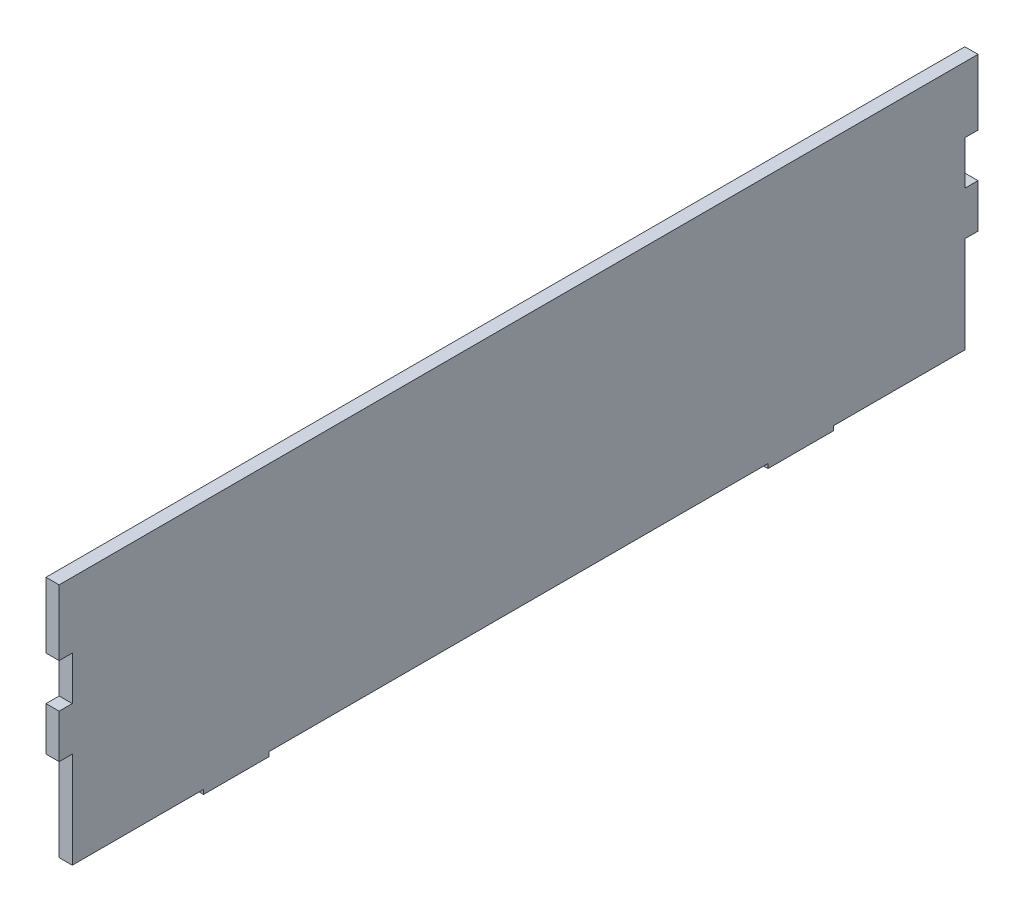
ISO-10303-21;
HEADER;
FILE_DESCRIPTION(('STEP AP214'),'2;1');
FILE_NAME('part.step','',(''),(''),'','','');
FILE_SCHEMA(('AUTOMOTIVE_DESIGN { 1 0 10303 214 1 1 1 1 }'));
ENDSEC;
DATA;
#1=APPLICATION_CONTEXT('core data for automotive mechanical design processes');
#2=APPLICATION_PROTOCOL_DEFINITION('international standard','automotive_design',2000,#1);
#3=PRODUCT_CONTEXT('',#1,'mechanical');
#4=PRODUCT('Part','Part','',(#3));
#5=PRODUCT_RELATED_PRODUCT_CATEGORY('part','',(#4));
#6=PRODUCT_DEFINITION_FORMATION('','',#4);
#7=PRODUCT_DEFINITION_CONTEXT('part definition',#1,'design');
#8=PRODUCT_DEFINITION('design','',#6,#7);
#9=PRODUCT_DEFINITION_SHAPE('','',#8);
#10=(LENGTH_UNIT() NAMED_UNIT(*) SI_UNIT(.MILLI.,.METRE.));
#11=(NAMED_UNIT(*) PLANE_ANGLE_UNIT() SI_UNIT($,.RADIAN.));
#12=(NAMED_UNIT(*) SI_UNIT($,.STERADIAN.) SOLID_ANGLE_UNIT());
#13=UNCERTAINTY_MEASURE_WITH_UNIT(LENGTH_MEASURE(1.E-05),#10,'distance_accuracy_value','');
#14=(GEOMETRIC_REPRESENTATION_CONTEXT(3) GLOBAL_UNCERTAINTY_ASSIGNED_CONTEXT((#13)) GLOBAL_UNIT_ASSIGNED_CONTEXT((#10,
#11,#12)) REPRESENTATION_CONTEXT('',''));
#15=CARTESIAN_POINT('',(0.,0.,0.));
#16=DIRECTION('',(0.,0.,1.));
#17=DIRECTION('',(1.,0.,0.));
#18=AXIS2_PLACEMENT_3D('',#15,#16,#17);
#19=CARTESIAN_POINT('',(0.,0.,-206.5));
#20=DIRECTION('',(0.,0.,-1.));
#21=DIRECTION('',(-1.,0.,0.));
#22=AXIS2_PLACEMENT_3D('',#19,#20,#21);
#23=PLANE('',#22);
#24=DIRECTION('',(1.,0.,0.));
#25=VECTOR('',#24,1.);
#26=CARTESIAN_POINT('',(2.99999999999998,-32.0782122905028,-206.5));
#27=LINE('',#26,#25);
#28=CARTESIAN_POINT('',(0.,-32.0782122905028,-206.5));
#29=VERTEX_POINT('',#28);
#30=CARTESIAN_POINT('',(2.99999999999998,-32.0782122905028,-206.5));
#31=VERTEX_POINT('',#30);
#32=EDGE_CURVE('E230',#29,#31,#27,.T.);
#33=ORIENTED_EDGE('',*,*,#32,.T.);
#34=DIRECTION('',(0.,-1.,0.));
#35=VECTOR('',#34,1.);
#36=CARTESIAN_POINT('',(3.,-1.07821229050276,-206.5));
#37=LINE('',#36,#35);
#38=CARTESIAN_POINT('',(3.00000000000002,-54.0782122905028,-206.5));
#39=VERTEX_POINT('',#38);
#40=EDGE_CURVE('E207',#31,#39,#37,.T.);
#41=ORIENTED_EDGE('',*,*,#40,.T.);
#42=DIRECTION('',(-1.,0.,0.));
#43=VECTOR('',#42,1.);
#44=CARTESIAN_POINT('',(0.,-54.0782122905028,-206.5));
#45=LINE('',#44,#43);
#46=CARTESIAN_POINT('',(0.,-54.0782122905028,-206.5));
#47=VERTEX_POINT('',#46);
#48=EDGE_CURVE('E11',#39,#47,#45,.T.);
#49=ORIENTED_EDGE('',*,*,#48,.T.);
#50=DIRECTION('',(0.,1.,0.));
#51=VECTOR('',#50,1.);
#52=CARTESIAN_POINT('',(0.,-59.0782122905028,-206.5));
#53=LINE('',#52,#51);
#54=EDGE_CURVE('E59',#47,#29,#53,.T.);
#55=ORIENTED_EDGE('',*,*,#54,.T.);
#56=EDGE_LOOP('',(#33,#41,#49,#55));
#57=FACE_BOUND('',#56,.T.);
#58=ADVANCED_FACE('F37',(#57),#23,.T.);
#59=DIRECTION('',(-1.,0.,0.));
#60=VECTOR('',#59,1.);
#61=CARTESIAN_POINT('',(2.99999999999998,-22.0782122905028,-206.5));
#62=LINE('',#61,#60);
#63=CARTESIAN_POINT('',(3.,-22.0782122905028,-206.5));
#64=VERTEX_POINT('',#63);
#65=CARTESIAN_POINT('',(0.,-22.0782122905028,-206.5));
#66=VERTEX_POINT('',#65);
#67=EDGE_CURVE('E52',#64,#66,#62,.T.);
#68=ORIENTED_EDGE('',*,*,#67,.T.);
#69=CARTESIAN_POINT('',(0.,-12.0782122905028,-206.5));
#70=VERTEX_POINT('',#69);
#71=EDGE_CURVE('E367',#66,#70,#53,.T.);
#72=ORIENTED_EDGE('',*,*,#71,.T.);
#73=DIRECTION('',(1.,0.,0.));
#74=VECTOR('',#73,1.);
#75=CARTESIAN_POINT('',(2.99999999999998,-12.0782122905028,-206.5));
#76=LINE('',#75,#74);
#77=CARTESIAN_POINT('',(3.,-12.0782122905028,-206.5));
#78=VERTEX_POINT('',#77);
#79=EDGE_CURVE('E211',#70,#78,#76,.T.);
#80=ORIENTED_EDGE('',*,*,#79,.T.);
#81=EDGE_CURVE('E373',#78,#64,#37,.T.);
#82=ORIENTED_EDGE('',*,*,#81,.T.);
#83=EDGE_LOOP('',(#68,#72,#80,#82));
#84=FACE_BOUND('',#83,.T.);
#85=ADVANCED_FACE('F424',(#84),#23,.T.);
#86=CARTESIAN_POINT('',(0.,0.,-2.5));
#87=DIRECTION('',(0.,0.,-1.));
#88=DIRECTION('',(-1.,0.,0.));
#89=AXIS2_PLACEMENT_3D('',#86,#87,#88);
#90=PLANE('',#89);
#91=DIRECTION('',(-1.,0.,0.));
#92=VECTOR('',#91,1.);
#93=CARTESIAN_POINT('',(2.99999999999998,-22.0782122905028,-2.5));
#94=LINE('',#93,#92);
#95=CARTESIAN_POINT('',(2.99999999999998,-22.0782122905028,-2.5));
#96=VERTEX_POINT('',#95);
#97=CARTESIAN_POINT('',(0.,-22.0782122905028,-2.5));
#98=VERTEX_POINT('',#97);
#99=EDGE_CURVE('E257',#96,#98,#94,.T.);
#100=ORIENTED_EDGE('',*,*,#99,.F.);
#101=DIRECTION('',(0.,1.,0.));
#102=VECTOR('',#101,1.);
#103=CARTESIAN_POINT('',(3.,-1.07821229050276,-2.5));
#104=LINE('',#103,#102);
#105=CARTESIAN_POINT('',(2.99999999999998,-12.0782122905028,-2.5));
#106=VERTEX_POINT('',#105);
#107=EDGE_CURVE('E375',#96,#106,#104,.T.);
#108=ORIENTED_EDGE('',*,*,#107,.T.);
#109=DIRECTION('',(1.,0.,0.));
#110=VECTOR('',#109,1.);
#111=CARTESIAN_POINT('',(2.99999999999998,-12.0782122905028,-2.5));
#112=LINE('',#111,#110);
#113=CARTESIAN_POINT('',(0.,-12.0782122905028,-2.5));
#114=VERTEX_POINT('',#113);
#115=EDGE_CURVE('E284',#114,#106,#112,.T.);
#116=ORIENTED_EDGE('',*,*,#115,.F.);
#117=DIRECTION('',(0.,-1.,0.));
#118=VECTOR('',#117,1.);
#119=CARTESIAN_POINT('',(0.,-59.0782122905028,-2.5));
#120=LINE('',#119,#118);
#121=EDGE_CURVE('E371',#114,#98,#120,.T.);
#122=ORIENTED_EDGE('',*,*,#121,.T.);
#123=EDGE_LOOP('',(#100,#108,#116,#122));
#124=FACE_BOUND('',#123,.T.);
#125=ADVANCED_FACE('F448',(#124),#90,.F.);
#126=DIRECTION('',(1.,0.,0.));
#127=VECTOR('',#126,1.);
#128=CARTESIAN_POINT('',(2.99999999999998,-32.0782122905028,-2.5));
#129=LINE('',#128,#127);
#130=CARTESIAN_POINT('',(0.,-32.0782122905028,-2.5));
#131=VERTEX_POINT('',#130);
#132=CARTESIAN_POINT('',(3.,-32.0782122905028,-2.5));
#133=VERTEX_POINT('',#132);
#134=EDGE_CURVE('E262',#131,#133,#129,.T.);
#135=ORIENTED_EDGE('',*,*,#134,.F.);
#136=CARTESIAN_POINT('',(0.,-54.0782122905028,-2.5));
#137=VERTEX_POINT('',#136);
#138=EDGE_CURVE('E370',#131,#137,#120,.T.);
#139=ORIENTED_EDGE('',*,*,#138,.T.);
#140=DIRECTION('',(1.,0.,0.));
#141=VECTOR('',#140,1.);
#142=CARTESIAN_POINT('',(-87.,-54.0782122905028,-2.5));
#143=LINE('',#142,#141);
#144=CARTESIAN_POINT('',(2.99999999999999,-54.0782122905028,-2.5));
#145=VERTEX_POINT('',#144);
#146=EDGE_CURVE('E361',#137,#145,#143,.T.);
#147=ORIENTED_EDGE('',*,*,#146,.T.);
#148=EDGE_CURVE('E376',#145,#133,#104,.T.);
#149=ORIENTED_EDGE('',*,*,#148,.T.);
#150=EDGE_LOOP('',(#135,#139,#147,#149));
#151=FACE_BOUND('',#150,.T.);
#152=ADVANCED_FACE('F389',(#151),#90,.F.);
#153=CARTESIAN_POINT('',(-87.,-54.0782122905028,-2.5));
#154=DIRECTION('',(0.,-1.,0.));
#155=DIRECTION('',(0.,0.,-1.));
#156=AXIS2_PLACEMENT_3D('',#153,#154,#155);
#157=PLANE('',#156);
#158=DIRECTION('',(0.,0.,-1.));
#159=VECTOR('',#158,1.);
#160=CARTESIAN_POINT('',(0.,-54.0782122905028,0.5));
#161=LINE('',#160,#159);
#162=CARTESIAN_POINT('',(0.,-54.0782122905028,-47.5));
#163=VERTEX_POINT('',#162);
#164=CARTESIAN_POINT('',(0.,-54.0782122905028,-161.5));
#165=VERTEX_POINT('',#164);
#166=EDGE_CURVE('E368',#163,#165,#161,.T.);
#167=ORIENTED_EDGE('',*,*,#166,.T.);
#168=DIRECTION('',(-1.,0.,0.));
#169=VECTOR('',#168,1.);
#170=CARTESIAN_POINT('',(3.00000000000002,-54.0782122905028,-161.5));
#171=LINE('',#170,#169);
#172=CARTESIAN_POINT('',(3.00000000000002,-54.0782122905028,-161.5));
#173=VERTEX_POINT('',#172);
#174=EDGE_CURVE('E307',#173,#165,#171,.T.);
#175=ORIENTED_EDGE('',*,*,#174,.F.);
#176=DIRECTION('',(0.,0.,1.));
#177=VECTOR('',#176,1.);
#178=CARTESIAN_POINT('',(3.,-54.0782122905028,-104.5));
#179=LINE('',#178,#177);
#180=CARTESIAN_POINT('',(3.,-54.0782122905028,-47.5));
#181=VERTEX_POINT('',#180);
#182=EDGE_CURVE('E378',#173,#181,#179,.T.);
#183=ORIENTED_EDGE('',*,*,#182,.T.);
#184=DIRECTION('',(1.,0.,0.));
#185=VECTOR('',#184,1.);
#186=CARTESIAN_POINT('',(3.,-54.0782122905028,-47.5));
#187=LINE('',#186,#185);
#188=EDGE_CURVE('E339',#163,#181,#187,.T.);
#189=ORIENTED_EDGE('',*,*,#188,.F.);
#190=EDGE_LOOP('',(#167,#175,#183,#189));
#191=FACE_BOUND('',#190,.T.);
#192=ADVANCED_FACE('F414',(#191),#157,.T.);
#193=CARTESIAN_POINT('',(3.,-54.0782122905028,-176.5));
#194=VERTEX_POINT('',#193);
#195=EDGE_CURVE('E45',#39,#194,#179,.T.);
#196=ORIENTED_EDGE('',*,*,#195,.T.);
#197=DIRECTION('',(1.,0.,0.));
#198=VECTOR('',#197,1.);
#199=CARTESIAN_POINT('',(3.00000000000002,-54.0782122905028,-176.5));
#200=LINE('',#199,#198);
#201=CARTESIAN_POINT('',(0.,-54.0782122905028,-176.5));
#202=VERTEX_POINT('',#201);
#203=EDGE_CURVE('E312',#202,#194,#200,.T.);
#204=ORIENTED_EDGE('',*,*,#203,.F.);
#205=EDGE_CURVE('E364',#202,#47,#161,.T.);
#206=ORIENTED_EDGE('',*,*,#205,.T.);
#207=ORIENTED_EDGE('',*,*,#48,.F.);
#208=EDGE_LOOP('',(#196,#204,#206,#207));
#209=FACE_BOUND('',#208,.T.);
#210=ADVANCED_FACE('F419',(#209),#157,.T.);
#211=CARTESIAN_POINT('',(0.,-1.07821229050276,0.5));
#212=DIRECTION('',(1.,0.,0.));
#213=DIRECTION('',(0.,1.,0.));
#214=AXIS2_PLACEMENT_3D('',#211,#212,#213);
#215=PLANE('',#214);
#216=CARTESIAN_POINT('',(0.,-54.0782122905028,-32.5));
#217=VERTEX_POINT('',#216);
#218=EDGE_CURVE('E365',#137,#217,#161,.T.);
#219=ORIENTED_EDGE('',*,*,#218,.F.);
#220=ORIENTED_EDGE('',*,*,#138,.F.);
#221=DIRECTION('',(0.,0.,-1.));
#222=VECTOR('',#221,1.);
#223=CARTESIAN_POINT('',(0.,-32.0782122905028,0.5));
#224=LINE('',#223,#222);
#225=CARTESIAN_POINT('',(0.,-32.0782122905028,0.5));
#226=VERTEX_POINT('',#225);
#227=EDGE_CURVE('E275',#226,#131,#224,.T.);
#228=ORIENTED_EDGE('',*,*,#227,.F.);
#229=DIRECTION('',(0.,-1.,0.));
#230=VECTOR('',#229,1.);
#231=CARTESIAN_POINT('',(0.,-22.0782122905028,0.5));
#232=LINE('',#231,#230);
#233=CARTESIAN_POINT('',(0.,-22.0782122905028,0.5));
#234=VERTEX_POINT('',#233);
#235=EDGE_CURVE('E264',#234,#226,#232,.T.);
#236=ORIENTED_EDGE('',*,*,#235,.F.);
#237=DIRECTION('',(0.,0.,-1.));
#238=VECTOR('',#237,1.);
#239=CARTESIAN_POINT('',(0.,-22.0782122905028,0.5));
#240=LINE('',#239,#238);
#241=EDGE_CURVE('E278',#234,#98,#240,.T.);
#242=ORIENTED_EDGE('',*,*,#241,.T.);
#243=ORIENTED_EDGE('',*,*,#121,.F.);
#244=DIRECTION('',(0.,0.,-1.));
#245=VECTOR('',#244,1.);
#246=CARTESIAN_POINT('',(0.,-12.0782122905028,0.5));
#247=LINE('',#246,#245);
#248=CARTESIAN_POINT('',(0.,-12.0782122905028,0.5));
#249=VERTEX_POINT('',#248);
#250=EDGE_CURVE('E300',#249,#114,#247,.T.);
#251=ORIENTED_EDGE('',*,*,#250,.F.);
#252=DIRECTION('',(0.,-1.,0.));
#253=VECTOR('',#252,1.);
#254=CARTESIAN_POINT('',(0.,2.92178770949724,0.5));
#255=LINE('',#254,#253);
#256=CARTESIAN_POINT('',(0.,2.92178770949724,0.5));
#257=VERTEX_POINT('',#256);
#258=EDGE_CURVE('E291',#257,#249,#255,.T.);
#259=ORIENTED_EDGE('',*,*,#258,.F.);
#260=DIRECTION('',(0.,0.,1.));
#261=VECTOR('',#260,1.);
#262=CARTESIAN_POINT('',(0.,2.92178770949724,-2.5));
#263=LINE('',#262,#261);
#264=CARTESIAN_POINT('',(0.,2.92178770949724,-209.5));
#265=VERTEX_POINT('',#264);
#266=EDGE_CURVE('E305',#265,#257,#263,.T.);
#267=ORIENTED_EDGE('',*,*,#266,.F.);
#268=DIRECTION('',(0.,-1.,0.));
#269=VECTOR('',#268,1.);
#270=CARTESIAN_POINT('',(0.,2.92178770949724,-209.5));
#271=LINE('',#270,#269);
#272=CARTESIAN_POINT('',(0.,-12.0782122905028,-209.5));
#273=VERTEX_POINT('',#272);
#274=EDGE_CURVE('E244',#265,#273,#271,.T.);
#275=ORIENTED_EDGE('',*,*,#274,.T.);
#276=DIRECTION('',(0.,0.,1.));
#277=VECTOR('',#276,1.);
#278=CARTESIAN_POINT('',(0.,-12.0782122905028,-209.5));
#279=LINE('',#278,#277);
#280=EDGE_CURVE('E250',#273,#70,#279,.T.);
#281=ORIENTED_EDGE('',*,*,#280,.T.);
#282=ORIENTED_EDGE('',*,*,#71,.F.);
#283=DIRECTION('',(0.,0.,1.));
#284=VECTOR('',#283,1.);
#285=CARTESIAN_POINT('',(0.,-22.0782122905028,-209.5));
#286=LINE('',#285,#284);
#287=CARTESIAN_POINT('',(0.,-22.0782122905028,-209.5));
#288=VERTEX_POINT('',#287);
#289=EDGE_CURVE('E234',#288,#66,#286,.T.);
#290=ORIENTED_EDGE('',*,*,#289,.F.);
#291=DIRECTION('',(0.,-1.,0.));
#292=VECTOR('',#291,1.);
#293=CARTESIAN_POINT('',(0.,-22.0782122905028,-209.5));
#294=LINE('',#293,#292);
#295=CARTESIAN_POINT('',(0.,-32.0782122905028,-209.5));
#296=VERTEX_POINT('',#295);
#297=EDGE_CURVE('E224',#288,#296,#294,.T.);
#298=ORIENTED_EDGE('',*,*,#297,.T.);
#299=DIRECTION('',(0.,0.,1.));
#300=VECTOR('',#299,1.);
#301=CARTESIAN_POINT('',(0.,-32.0782122905028,-209.5));
#302=LINE('',#301,#300);
#303=EDGE_CURVE('E212',#296,#29,#302,.T.);
#304=ORIENTED_EDGE('',*,*,#303,.T.);
#305=ORIENTED_EDGE('',*,*,#54,.F.);
#306=ORIENTED_EDGE('',*,*,#205,.F.);
#307=DIRECTION('',(0.,1.,0.));
#308=VECTOR('',#307,1.);
#309=CARTESIAN_POINT('',(0.,-55.0782122905028,-176.5));
#310=LINE('',#309,#308);
#311=CARTESIAN_POINT('',(0.,-55.0782122905028,-176.5));
#312=VERTEX_POINT('',#311);
#313=EDGE_CURVE('E325',#312,#202,#310,.T.);
#314=ORIENTED_EDGE('',*,*,#313,.F.);
#315=DIRECTION('',(0.,0.,-1.));
#316=VECTOR('',#315,1.);
#317=CARTESIAN_POINT('',(0.,-55.0782122905028,-176.5));
#318=LINE('',#317,#316);
#319=CARTESIAN_POINT('',(0.,-55.0782122905028,-161.5));
#320=VERTEX_POINT('',#319);
#321=EDGE_CURVE('E314',#320,#312,#318,.T.);
#322=ORIENTED_EDGE('',*,*,#321,.F.);
#323=DIRECTION('',(0.,1.,0.));
#324=VECTOR('',#323,1.);
#325=CARTESIAN_POINT('',(0.,-55.0782122905028,-161.5));
#326=LINE('',#325,#324);
#327=EDGE_CURVE('E328',#320,#165,#326,.T.);
#328=ORIENTED_EDGE('',*,*,#327,.T.);
#329=ORIENTED_EDGE('',*,*,#166,.F.);
#330=DIRECTION('',(0.,1.,0.));
#331=VECTOR('',#330,1.);
#332=CARTESIAN_POINT('',(0.,-55.0782122905028,-47.5));
#333=LINE('',#332,#331);
#334=CARTESIAN_POINT('',(0.,-55.0782122905028,-47.5));
#335=VERTEX_POINT('',#334);
#336=EDGE_CURVE('E352',#335,#163,#333,.T.);
#337=ORIENTED_EDGE('',*,*,#336,.F.);
#338=DIRECTION('',(0.,0.,-1.));
#339=VECTOR('',#338,1.);
#340=CARTESIAN_POINT('',(0.,-55.0782122905028,-32.5));
#341=LINE('',#340,#339);
#342=CARTESIAN_POINT('',(0.,-55.0782122905028,-32.5));
#343=VERTEX_POINT('',#342);
#344=EDGE_CURVE('E341',#343,#335,#341,.T.);
#345=ORIENTED_EDGE('',*,*,#344,.F.);
#346=DIRECTION('',(0.,1.,0.));
#347=VECTOR('',#346,1.);
#348=CARTESIAN_POINT('',(0.,-55.0782122905028,-32.5));
#349=LINE('',#348,#347);
#350=EDGE_CURVE('E355',#343,#217,#349,.T.);
#351=ORIENTED_EDGE('',*,*,#350,.T.);
#352=EDGE_LOOP('',(#219,#220,#228,#236,#242,#243,#251,#259,#267,#275,#281,#282,#290,#298,#304,
#305,#306,#314,#322,#328,#329,#337,#345,#351));
#353=FACE_BOUND('',#352,.T.);
#354=ADVANCED_FACE('F39',(#353),#215,.F.);
#355=CARTESIAN_POINT('',(3.,-1.07821229050276,-104.5));
#356=DIRECTION('',(-1.,0.,0.));
#357=DIRECTION('',(0.,-1.,0.));
#358=AXIS2_PLACEMENT_3D('',#355,#356,#357);
#359=PLANE('',#358);
#360=ORIENTED_EDGE('',*,*,#81,.F.);
#361=DIRECTION('',(0.,0.,1.));
#362=VECTOR('',#361,1.);
#363=CARTESIAN_POINT('',(2.99999999999998,-12.0782122905028,-209.5));
#364=LINE('',#363,#362);
#365=CARTESIAN_POINT('',(2.99999999999998,-12.0782122905028,-209.5));
#366=VERTEX_POINT('',#365);
#367=EDGE_CURVE('E255',#366,#78,#364,.T.);
#368=ORIENTED_EDGE('',*,*,#367,.F.);
#369=DIRECTION('',(0.,1.,0.));
#370=VECTOR('',#369,1.);
#371=CARTESIAN_POINT('',(3.,2.92178770949724,-209.5));
#372=LINE('',#371,#370);
#373=CARTESIAN_POINT('',(3.,2.92178770949724,-209.5));
#374=VERTEX_POINT('',#373);
#375=EDGE_CURVE('E238',#366,#374,#372,.T.);
#376=ORIENTED_EDGE('',*,*,#375,.T.);
#377=DIRECTION('',(0.,0.,-1.));
#378=VECTOR('',#377,1.);
#379=CARTESIAN_POINT('',(3.,2.92178770949724,-2.5));
#380=LINE('',#379,#378);
#381=CARTESIAN_POINT('',(3.,2.92178770949724,0.5));
#382=VERTEX_POINT('',#381);
#383=EDGE_CURVE('E303',#382,#374,#380,.T.);
#384=ORIENTED_EDGE('',*,*,#383,.F.);
#385=DIRECTION('',(0.,1.,0.));
#386=VECTOR('',#385,1.);
#387=CARTESIAN_POINT('',(3.,2.92178770949724,0.5));
#388=LINE('',#387,#386);
#389=CARTESIAN_POINT('',(2.99999999999998,-12.0782122905028,0.5));
#390=VERTEX_POINT('',#389);
#391=EDGE_CURVE('E285',#390,#382,#388,.T.);
#392=ORIENTED_EDGE('',*,*,#391,.F.);
#393=DIRECTION('',(0.,0.,-1.));
#394=VECTOR('',#393,1.);
#395=CARTESIAN_POINT('',(2.99999999999998,-12.0782122905028,0.5));
#396=LINE('',#395,#394);
#397=EDGE_CURVE('E295',#390,#106,#396,.T.);
#398=ORIENTED_EDGE('',*,*,#397,.T.);
#399=ORIENTED_EDGE('',*,*,#107,.F.);
#400=DIRECTION('',(0.,0.,-1.));
#401=VECTOR('',#400,1.);
#402=CARTESIAN_POINT('',(2.99999999999998,-22.0782122905028,0.5));
#403=LINE('',#402,#401);
#404=CARTESIAN_POINT('',(2.99999999999998,-22.0782122905028,0.5));
#405=VERTEX_POINT('',#404);
#406=EDGE_CURVE('E281',#405,#96,#403,.T.);
#407=ORIENTED_EDGE('',*,*,#406,.F.);
#408=DIRECTION('',(0.,1.,0.));
#409=VECTOR('',#408,1.);
#410=CARTESIAN_POINT('',(2.99999999999998,-22.0782122905028,0.5));
#411=LINE('',#410,#409);
#412=CARTESIAN_POINT('',(2.99999999999998,-32.0782122905028,0.5));
#413=VERTEX_POINT('',#412);
#414=EDGE_CURVE('E258',#413,#405,#411,.T.);
#415=ORIENTED_EDGE('',*,*,#414,.F.);
#416=DIRECTION('',(0.,0.,-1.));
#417=VECTOR('',#416,1.);
#418=CARTESIAN_POINT('',(2.99999999999998,-32.0782122905028,0.5));
#419=LINE('',#418,#417);
#420=EDGE_CURVE('E268',#413,#133,#419,.T.);
#421=ORIENTED_EDGE('',*,*,#420,.T.);
#422=ORIENTED_EDGE('',*,*,#148,.F.);
#423=CARTESIAN_POINT('',(3.,-54.0782122905028,-32.5));
#424=VERTEX_POINT('',#423);
#425=EDGE_CURVE('E377',#424,#145,#179,.T.);
#426=ORIENTED_EDGE('',*,*,#425,.F.);
#427=DIRECTION('',(0.,1.,0.));
#428=VECTOR('',#427,1.);
#429=CARTESIAN_POINT('',(3.,-55.0782122905028,-32.5));
#430=LINE('',#429,#428);
#431=CARTESIAN_POINT('',(3.,-55.0782122905028,-32.5));
#432=VERTEX_POINT('',#431);
#433=EDGE_CURVE('E358',#432,#424,#430,.T.);
#434=ORIENTED_EDGE('',*,*,#433,.F.);
#435=DIRECTION('',(0.,0.,1.));
#436=VECTOR('',#435,1.);
#437=CARTESIAN_POINT('',(3.,-55.0782122905028,-32.5));
#438=LINE('',#437,#436);
#439=CARTESIAN_POINT('',(3.,-55.0782122905028,-47.5));
#440=VERTEX_POINT('',#439);
#441=EDGE_CURVE('E335',#440,#432,#438,.T.);
#442=ORIENTED_EDGE('',*,*,#441,.F.);
#443=DIRECTION('',(0.,1.,0.));
#444=VECTOR('',#443,1.);
#445=CARTESIAN_POINT('',(3.,-55.0782122905028,-47.5));
#446=LINE('',#445,#444);
#447=EDGE_CURVE('E345',#440,#181,#446,.T.);
#448=ORIENTED_EDGE('',*,*,#447,.T.);
#449=ORIENTED_EDGE('',*,*,#182,.F.);
#450=DIRECTION('',(0.,1.,0.));
#451=VECTOR('',#450,1.);
#452=CARTESIAN_POINT('',(3.00000000000002,-55.0782122905028,-161.5));
#453=LINE('',#452,#451);
#454=CARTESIAN_POINT('',(3.00000000000002,-55.0782122905028,-161.5));
#455=VERTEX_POINT('',#454);
#456=EDGE_CURVE('E331',#455,#173,#453,.T.);
#457=ORIENTED_EDGE('',*,*,#456,.F.);
#458=DIRECTION('',(0.,0.,1.));
#459=VECTOR('',#458,1.);
#460=CARTESIAN_POINT('',(3.00000000000002,-55.0782122905028,-176.5));
#461=LINE('',#460,#459);
#462=CARTESIAN_POINT('',(3.00000000000002,-55.0782122905028,-176.5));
#463=VERTEX_POINT('',#462);
#464=EDGE_CURVE('E308',#463,#455,#461,.T.);
#465=ORIENTED_EDGE('',*,*,#464,.F.);
#466=DIRECTION('',(0.,1.,0.));
#467=VECTOR('',#466,1.);
#468=CARTESIAN_POINT('',(3.00000000000002,-55.0782122905028,-176.5));
#469=LINE('',#468,#467);
#470=EDGE_CURVE('E318',#463,#194,#469,.T.);
#471=ORIENTED_EDGE('',*,*,#470,.T.);
#472=ORIENTED_EDGE('',*,*,#195,.F.);
#473=ORIENTED_EDGE('',*,*,#40,.F.);
#474=DIRECTION('',(0.,0.,1.));
#475=VECTOR('',#474,1.);
#476=CARTESIAN_POINT('',(2.99999999999998,-32.0782122905028,-209.5));
#477=LINE('',#476,#475);
#478=CARTESIAN_POINT('',(2.99999999999998,-32.0782122905028,-209.5));
#479=VERTEX_POINT('',#478);
#480=EDGE_CURVE('E199',#479,#31,#477,.T.);
#481=ORIENTED_EDGE('',*,*,#480,.F.);
#482=DIRECTION('',(0.,1.,0.));
#483=VECTOR('',#482,1.);
#484=CARTESIAN_POINT('',(2.99999999999998,-22.0782122905028,-209.5));
#485=LINE('',#484,#483);
#486=CARTESIAN_POINT('',(2.99999999999998,-22.0782122905028,-209.5));
#487=VERTEX_POINT('',#486);
#488=EDGE_CURVE('E204',#479,#487,#485,.T.);
#489=ORIENTED_EDGE('',*,*,#488,.T.);
#490=DIRECTION('',(0.,0.,1.));
#491=VECTOR('',#490,1.);
#492=CARTESIAN_POINT('',(2.99999999999998,-22.0782122905028,-209.5));
#493=LINE('',#492,#491);
#494=EDGE_CURVE('E229',#487,#64,#493,.T.);
#495=ORIENTED_EDGE('',*,*,#494,.T.);
#496=EDGE_LOOP('',(#360,#368,#376,#384,#392,#398,#399,#407,#415,#421,#422,#426,#434,#442,#448,
#449,#457,#465,#471,#472,#473,#481,#489,#495));
#497=FACE_BOUND('',#496,.T.);
#498=ADVANCED_FACE('F202',(#497),#359,.F.);
#499=DIRECTION('',(-1.,0.,0.));
#500=VECTOR('',#499,1.);
#501=CARTESIAN_POINT('',(3.,-54.0782122905028,-32.5));
#502=LINE('',#501,#500);
#503=EDGE_CURVE('E334',#424,#217,#502,.T.);
#504=ORIENTED_EDGE('',*,*,#503,.F.);
#505=ORIENTED_EDGE('',*,*,#425,.T.);
#506=ORIENTED_EDGE('',*,*,#146,.F.);
#507=ORIENTED_EDGE('',*,*,#218,.T.);
#508=EDGE_LOOP('',(#504,#505,#506,#507));
#509=FACE_BOUND('',#508,.T.);
#510=ADVANCED_FACE('F384',(#509),#157,.T.);
#511=CARTESIAN_POINT('',(3.,-55.0782122905028,-32.5));
#512=DIRECTION('',(0.,0.,-1.));
#513=DIRECTION('',(-1.,0.,0.));
#514=AXIS2_PLACEMENT_3D('',#511,#512,#513);
#515=PLANE('',#514);
#516=ORIENTED_EDGE('',*,*,#503,.T.);
#517=ORIENTED_EDGE('',*,*,#350,.F.);
#518=DIRECTION('',(-1.,0.,0.));
#519=VECTOR('',#518,1.);
#520=CARTESIAN_POINT('',(3.,-55.0782122905028,-32.5));
#521=LINE('',#520,#519);
#522=EDGE_CURVE('E338',#432,#343,#521,.T.);
#523=ORIENTED_EDGE('',*,*,#522,.F.);
#524=ORIENTED_EDGE('',*,*,#433,.T.);
#525=EDGE_LOOP('',(#516,#517,#523,#524));
#526=FACE_BOUND('',#525,.T.);
#527=ADVANCED_FACE('F403',(#526),#515,.F.);
#528=CARTESIAN_POINT('',(3.,-55.0782122905028,-47.5));
#529=DIRECTION('',(0.,0.,1.));
#530=DIRECTION('',(1.,0.,0.));
#531=AXIS2_PLACEMENT_3D('',#528,#529,#530);
#532=PLANE('',#531);
#533=ORIENTED_EDGE('',*,*,#188,.T.);
#534=ORIENTED_EDGE('',*,*,#447,.F.);
#535=DIRECTION('',(1.,0.,0.));
#536=VECTOR('',#535,1.);
#537=CARTESIAN_POINT('',(3.,-55.0782122905028,-47.5));
#538=LINE('',#537,#536);
#539=EDGE_CURVE('E343',#335,#440,#538,.T.);
#540=ORIENTED_EDGE('',*,*,#539,.F.);
#541=ORIENTED_EDGE('',*,*,#336,.T.);
#542=EDGE_LOOP('',(#533,#534,#540,#541));
#543=FACE_BOUND('',#542,.T.);
#544=ADVANCED_FACE('F411',(#543),#532,.F.);
#545=CARTESIAN_POINT('',(0.,-55.0782122905028,0.));
#546=DIRECTION('',(0.,1.,0.));
#547=DIRECTION('',(0.,0.,1.));
#548=AXIS2_PLACEMENT_3D('',#545,#546,#547);
#549=PLANE('',#548);
#550=ORIENTED_EDGE('',*,*,#441,.T.);
#551=ORIENTED_EDGE('',*,*,#522,.T.);
#552=ORIENTED_EDGE('',*,*,#344,.T.);
#553=ORIENTED_EDGE('',*,*,#539,.T.);
#554=EDGE_LOOP('',(#550,#551,#552,#553));
#555=FACE_BOUND('',#554,.T.);
#556=ADVANCED_FACE('F407',(#555),#549,.F.);
#557=CARTESIAN_POINT('',(3.00000000000002,-55.0782122905028,-161.5));
#558=DIRECTION('',(0.,0.,-1.));
#559=DIRECTION('',(-1.,0.,0.));
#560=AXIS2_PLACEMENT_3D('',#557,#558,#559);
#561=PLANE('',#560);
#562=ORIENTED_EDGE('',*,*,#174,.T.);
#563=ORIENTED_EDGE('',*,*,#327,.F.);
#564=DIRECTION('',(-1.,0.,0.));
#565=VECTOR('',#564,1.);
#566=CARTESIAN_POINT('',(3.00000000000002,-55.0782122905028,-161.5));
#567=LINE('',#566,#565);
#568=EDGE_CURVE('E311',#455,#320,#567,.T.);
#569=ORIENTED_EDGE('',*,*,#568,.F.);
#570=ORIENTED_EDGE('',*,*,#456,.T.);
#571=EDGE_LOOP('',(#562,#563,#569,#570));
#572=FACE_BOUND('',#571,.T.);
#573=ADVANCED_FACE('F660',(#572),#561,.F.);
#574=CARTESIAN_POINT('',(3.00000000000002,-55.0782122905028,-176.5));
#575=DIRECTION('',(0.,0.,1.));
#576=DIRECTION('',(1.,0.,0.));
#577=AXIS2_PLACEMENT_3D('',#574,#575,#576);
#578=PLANE('',#577);
#579=ORIENTED_EDGE('',*,*,#203,.T.);
#580=ORIENTED_EDGE('',*,*,#470,.F.);
#581=DIRECTION('',(1.,0.,0.));
#582=VECTOR('',#581,1.);
#583=CARTESIAN_POINT('',(3.00000000000002,-55.0782122905028,-176.5));
#584=LINE('',#583,#582);
#585=EDGE_CURVE('E316',#312,#463,#584,.T.);
#586=ORIENTED_EDGE('',*,*,#585,.F.);
#587=ORIENTED_EDGE('',*,*,#313,.T.);
#588=EDGE_LOOP('',(#579,#580,#586,#587));
#589=FACE_BOUND('',#588,.T.);
#590=ADVANCED_FACE('F652',(#589),#578,.F.);
#591=CARTESIAN_POINT('',(0.,-55.0782122905028,0.));
#592=DIRECTION('',(0.,-1.,0.));
#593=DIRECTION('',(0.,0.,-1.));
#594=AXIS2_PLACEMENT_3D('',#591,#592,#593);
#595=PLANE('',#594);
#596=ORIENTED_EDGE('',*,*,#464,.T.);
#597=ORIENTED_EDGE('',*,*,#568,.T.);
#598=ORIENTED_EDGE('',*,*,#321,.T.);
#599=ORIENTED_EDGE('',*,*,#585,.T.);
#600=EDGE_LOOP('',(#596,#597,#598,#599));
#601=FACE_BOUND('',#600,.T.);
#602=ADVANCED_FACE('F520',(#601),#595,.T.);
#603=CARTESIAN_POINT('',(0.,2.92178770949724,0.));
#604=DIRECTION('',(0.,1.,0.));
#605=DIRECTION('',(-1.,0.,0.));
#606=AXIS2_PLACEMENT_3D('',#603,#604,#605);
#607=PLANE('',#606);
#608=ORIENTED_EDGE('',*,*,#383,.T.);
#609=DIRECTION('',(-1.,0.,0.));
#610=VECTOR('',#609,1.);
#611=CARTESIAN_POINT('',(3.,2.92178770949724,-209.5));
#612=LINE('',#611,#610);
#613=EDGE_CURVE('E247',#374,#265,#612,.T.);
#614=ORIENTED_EDGE('',*,*,#613,.T.);
#615=ORIENTED_EDGE('',*,*,#266,.T.);
#616=DIRECTION('',(-1.,0.,0.));
#617=VECTOR('',#616,1.);
#618=CARTESIAN_POINT('',(3.,2.92178770949724,0.5));
#619=LINE('',#618,#617);
#620=EDGE_CURVE('E288',#382,#257,#619,.T.);
#621=ORIENTED_EDGE('',*,*,#620,.F.);
#622=EDGE_LOOP('',(#608,#614,#615,#621));
#623=FACE_BOUND('',#622,.T.);
#624=ADVANCED_FACE('F437',(#623),#607,.T.);
#625=CARTESIAN_POINT('',(2.99999999999998,-12.0782122905028,0.5));
#626=DIRECTION('',(0.,1.,0.));
#627=DIRECTION('',(0.,0.,1.));
#628=AXIS2_PLACEMENT_3D('',#625,#626,#627);
#629=PLANE('',#628);
#630=ORIENTED_EDGE('',*,*,#115,.T.);
#631=ORIENTED_EDGE('',*,*,#397,.F.);
#632=DIRECTION('',(1.,0.,0.));
#633=VECTOR('',#632,1.);
#634=CARTESIAN_POINT('',(2.99999999999998,-12.0782122905028,0.5));
#635=LINE('',#634,#633);
#636=EDGE_CURVE('E293',#249,#390,#635,.T.);
#637=ORIENTED_EDGE('',*,*,#636,.F.);
#638=ORIENTED_EDGE('',*,*,#250,.T.);
#639=EDGE_LOOP('',(#630,#631,#637,#638));
#640=FACE_BOUND('',#639,.T.);
#641=ADVANCED_FACE('F445',(#640),#629,.F.);
#642=CARTESIAN_POINT('',(0.,0.,0.5));
#643=DIRECTION('',(0.,0.,-1.));
#644=DIRECTION('',(-1.,0.,0.));
#645=AXIS2_PLACEMENT_3D('',#642,#643,#644);
#646=PLANE('',#645);
#647=ORIENTED_EDGE('',*,*,#391,.T.);
#648=ORIENTED_EDGE('',*,*,#620,.T.);
#649=ORIENTED_EDGE('',*,*,#258,.T.);
#650=ORIENTED_EDGE('',*,*,#636,.T.);
#651=EDGE_LOOP('',(#647,#648,#649,#650));
#652=FACE_BOUND('',#651,.T.);
#653=ADVANCED_FACE('F439',(#652),#646,.F.);
#654=CARTESIAN_POINT('',(2.99999999999998,-22.0782122905028,0.5));
#655=DIRECTION('',(0.,-1.,0.));
#656=DIRECTION('',(0.,0.,-1.));
#657=AXIS2_PLACEMENT_3D('',#654,#655,#656);
#658=PLANE('',#657);
#659=ORIENTED_EDGE('',*,*,#99,.T.);
#660=ORIENTED_EDGE('',*,*,#241,.F.);
#661=DIRECTION('',(-1.,0.,0.));
#662=VECTOR('',#661,1.);
#663=CARTESIAN_POINT('',(2.99999999999998,-22.0782122905028,0.5));
#664=LINE('',#663,#662);
#665=EDGE_CURVE('E261',#405,#234,#664,.T.);
#666=ORIENTED_EDGE('',*,*,#665,.F.);
#667=ORIENTED_EDGE('',*,*,#406,.T.);
#668=EDGE_LOOP('',(#659,#660,#666,#667));
#669=FACE_BOUND('',#668,.T.);
#670=ADVANCED_FACE('F451',(#669),#658,.F.);
#671=CARTESIAN_POINT('',(2.99999999999998,-32.0782122905028,0.5));
#672=DIRECTION('',(0.,1.,0.));
#673=DIRECTION('',(0.,0.,1.));
#674=AXIS2_PLACEMENT_3D('',#671,#672,#673);
#675=PLANE('',#674);
#676=ORIENTED_EDGE('',*,*,#134,.T.);
#677=ORIENTED_EDGE('',*,*,#420,.F.);
#678=DIRECTION('',(1.,0.,0.));
#679=VECTOR('',#678,1.);
#680=CARTESIAN_POINT('',(2.99999999999998,-32.0782122905028,0.5));
#681=LINE('',#680,#679);
#682=EDGE_CURVE('E266',#226,#413,#681,.T.);
#683=ORIENTED_EDGE('',*,*,#682,.F.);
#684=ORIENTED_EDGE('',*,*,#227,.T.);
#685=EDGE_LOOP('',(#676,#677,#683,#684));
#686=FACE_BOUND('',#685,.T.);
#687=ADVANCED_FACE('F396',(#686),#675,.F.);
#688=CARTESIAN_POINT('',(0.,0.,0.5));
#689=DIRECTION('',(0.,0.,-1.));
#690=DIRECTION('',(-1.,0.,0.));
#691=AXIS2_PLACEMENT_3D('',#688,#689,#690);
#692=PLANE('',#691);
#693=ORIENTED_EDGE('',*,*,#414,.T.);
#694=ORIENTED_EDGE('',*,*,#665,.T.);
#695=ORIENTED_EDGE('',*,*,#235,.T.);
#696=ORIENTED_EDGE('',*,*,#682,.T.);
#697=EDGE_LOOP('',(#693,#694,#695,#696));
#698=FACE_BOUND('',#697,.T.);
#699=ADVANCED_FACE('F453',(#698),#692,.F.);
#700=CARTESIAN_POINT('',(2.99999999999998,-12.0782122905028,-209.5));
#701=DIRECTION('',(0.,-1.,0.));
#702=DIRECTION('',(0.,0.,-1.));
#703=AXIS2_PLACEMENT_3D('',#700,#701,#702);
#704=PLANE('',#703);
#705=ORIENTED_EDGE('',*,*,#79,.F.);
#706=ORIENTED_EDGE('',*,*,#280,.F.);
#707=DIRECTION('',(1.,0.,0.));
#708=VECTOR('',#707,1.);
#709=CARTESIAN_POINT('',(2.99999999999998,-12.0782122905028,-209.5));
#710=LINE('',#709,#708);
#711=EDGE_CURVE('E241',#273,#366,#710,.T.);
#712=ORIENTED_EDGE('',*,*,#711,.T.);
#713=ORIENTED_EDGE('',*,*,#367,.T.);
#714=EDGE_LOOP('',(#705,#706,#712,#713));
#715=FACE_BOUND('',#714,.T.);
#716=ADVANCED_FACE('F427',(#715),#704,.T.);
#717=CARTESIAN_POINT('',(0.,0.,-209.5));
#718=DIRECTION('',(0.,0.,1.));
#719=DIRECTION('',(-1.,0.,0.));
#720=AXIS2_PLACEMENT_3D('',#717,#718,#719);
#721=PLANE('',#720);
#722=ORIENTED_EDGE('',*,*,#375,.F.);
#723=ORIENTED_EDGE('',*,*,#711,.F.);
#724=ORIENTED_EDGE('',*,*,#274,.F.);
#725=ORIENTED_EDGE('',*,*,#613,.F.);
#726=EDGE_LOOP('',(#722,#723,#724,#725));
#727=FACE_BOUND('',#726,.T.);
#728=ADVANCED_FACE('F431',(#727),#721,.F.);
#729=CARTESIAN_POINT('',(2.99999999999998,-32.0782122905028,-209.5));
#730=DIRECTION('',(0.,-1.,0.));
#731=DIRECTION('',(0.,0.,-1.));
#732=AXIS2_PLACEMENT_3D('',#729,#730,#731);
#733=PLANE('',#732);
#734=ORIENTED_EDGE('',*,*,#32,.F.);
#735=ORIENTED_EDGE('',*,*,#303,.F.);
#736=DIRECTION('',(1.,0.,0.));
#737=VECTOR('',#736,1.);
#738=CARTESIAN_POINT('',(2.99999999999998,-32.0782122905028,-209.5));
#739=LINE('',#738,#737);
#740=EDGE_CURVE('E218',#296,#479,#739,.T.);
#741=ORIENTED_EDGE('',*,*,#740,.T.);
#742=ORIENTED_EDGE('',*,*,#480,.T.);
#743=EDGE_LOOP('',(#734,#735,#741,#742));
#744=FACE_BOUND('',#743,.T.);
#745=ADVANCED_FACE('F223',(#744),#733,.T.);
#746=CARTESIAN_POINT('',(2.99999999999998,-22.0782122905028,-209.5));
#747=DIRECTION('',(0.,1.,0.));
#748=DIRECTION('',(0.,0.,1.));
#749=AXIS2_PLACEMENT_3D('',#746,#747,#748);
#750=PLANE('',#749);
#751=ORIENTED_EDGE('',*,*,#67,.F.);
#752=ORIENTED_EDGE('',*,*,#494,.F.);
#753=DIRECTION('',(-1.,0.,0.));
#754=VECTOR('',#753,1.);
#755=CARTESIAN_POINT('',(2.99999999999998,-22.0782122905028,-209.5));
#756=LINE('',#755,#754);
#757=EDGE_CURVE('E221',#487,#288,#756,.T.);
#758=ORIENTED_EDGE('',*,*,#757,.T.);
#759=ORIENTED_EDGE('',*,*,#289,.T.);
#760=EDGE_LOOP('',(#751,#752,#758,#759));
#761=FACE_BOUND('',#760,.T.);
#762=ADVANCED_FACE('F422',(#761),#750,.T.);
#763=CARTESIAN_POINT('',(0.,0.,-209.5));
#764=DIRECTION('',(0.,0.,1.));
#765=DIRECTION('',(-1.,0.,0.));
#766=AXIS2_PLACEMENT_3D('',#763,#764,#765);
#767=PLANE('',#766);
#768=ORIENTED_EDGE('',*,*,#488,.F.);
#769=ORIENTED_EDGE('',*,*,#740,.F.);
#770=ORIENTED_EDGE('',*,*,#297,.F.);
#771=ORIENTED_EDGE('',*,*,#757,.F.);
#772=EDGE_LOOP('',(#768,#769,#770,#771));
#773=FACE_BOUND('',#772,.T.);
#774=ADVANCED_FACE('F216',(#773),#767,.F.);
#775=CLOSED_SHELL('',(#58,#85,#125,#152,#192,#210,#354,#498,#510,#527,#544,#556,#573,#590,#602,
#624,#641,#653,#670,#687,#699,#716,#728,#745,#762,#774));
#776=MANIFOLD_SOLID_BREP('B2',#775);
#777=ADVANCED_BREP_SHAPE_REPRESENTATION('',(#18,#776),#14);
#778=SHAPE_DEFINITION_REPRESENTATION(#9,#777);
ENDSEC;
END-ISO-10303-21;
